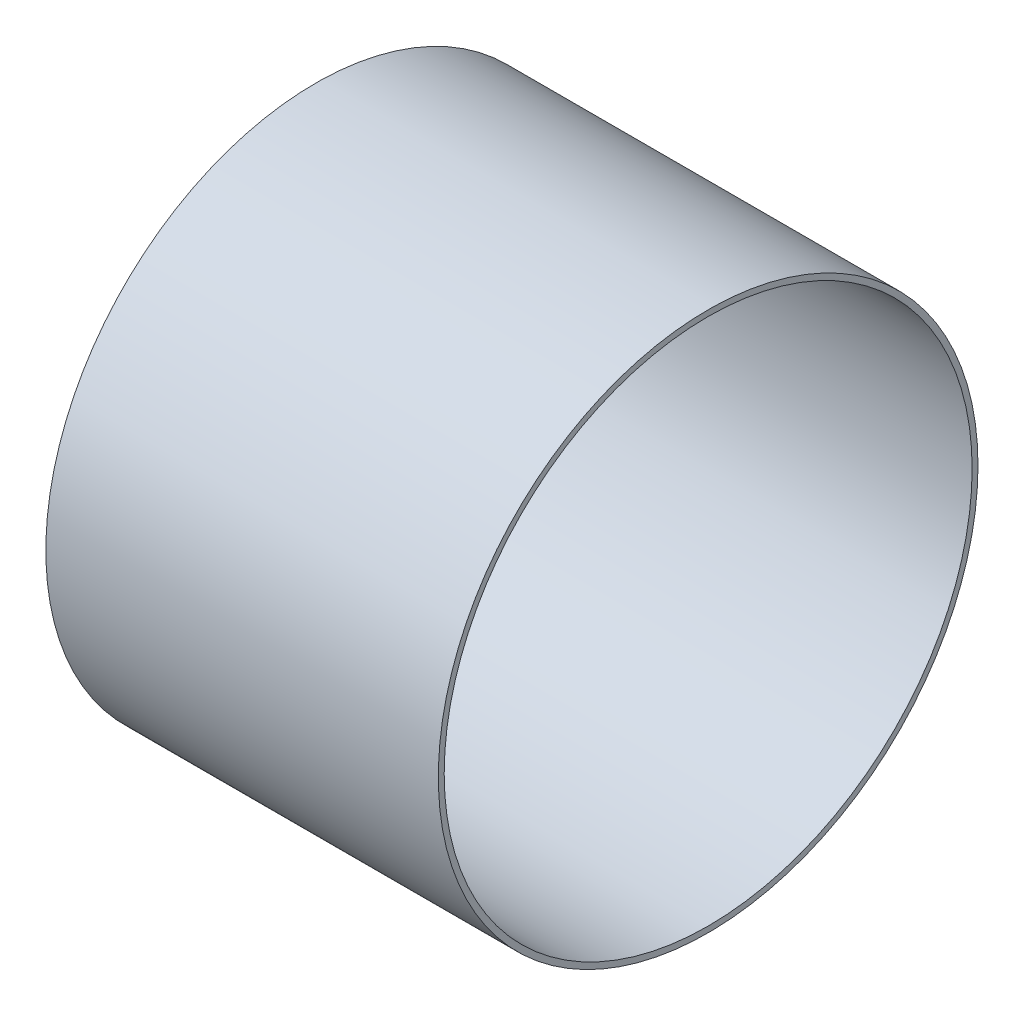
ISO-10303-21;
HEADER;
FILE_DESCRIPTION(('STEP AP214'),'2;1');
FILE_NAME('part.step','',(''),(''),'','','');
FILE_SCHEMA(('AUTOMOTIVE_DESIGN { 1 0 10303 214 1 1 1 1 }'));
ENDSEC;
DATA;
#1=APPLICATION_CONTEXT('core data for automotive mechanical design processes');
#2=APPLICATION_PROTOCOL_DEFINITION('international standard','automotive_design',2000,#1);
#3=PRODUCT_CONTEXT('',#1,'mechanical');
#4=PRODUCT('Part','Part','',(#3));
#5=PRODUCT_RELATED_PRODUCT_CATEGORY('part','',(#4));
#6=PRODUCT_DEFINITION_FORMATION('','',#4);
#7=PRODUCT_DEFINITION_CONTEXT('part definition',#1,'design');
#8=PRODUCT_DEFINITION('design','',#6,#7);
#9=PRODUCT_DEFINITION_SHAPE('','',#8);
#10=(LENGTH_UNIT() NAMED_UNIT(*) SI_UNIT(.MILLI.,.METRE.));
#11=(NAMED_UNIT(*) PLANE_ANGLE_UNIT() SI_UNIT($,.RADIAN.));
#12=(NAMED_UNIT(*) SI_UNIT($,.STERADIAN.) SOLID_ANGLE_UNIT());
#13=UNCERTAINTY_MEASURE_WITH_UNIT(LENGTH_MEASURE(1.E-05),#10,'distance_accuracy_value','');
#14=(GEOMETRIC_REPRESENTATION_CONTEXT(3) GLOBAL_UNCERTAINTY_ASSIGNED_CONTEXT((#13)) GLOBAL_UNIT_ASSIGNED_CONTEXT((#10,
#11,#12)) REPRESENTATION_CONTEXT('',''));
#15=CARTESIAN_POINT('',(0.,0.,0.));
#16=DIRECTION('',(0.,0.,1.));
#17=DIRECTION('',(1.,0.,0.));
#18=AXIS2_PLACEMENT_3D('',#15,#16,#17);
#19=CARTESIAN_POINT('',(101.6,0.,0.));
#20=DIRECTION('',(1.,0.,0.));
#21=DIRECTION('',(0.,0.,-1.));
#22=AXIS2_PLACEMENT_3D('',#19,#20,#21);
#23=PLANE('',#22);
#24=CARTESIAN_POINT('',(101.6,0.,0.));
#25=DIRECTION('',(1.,0.,0.));
#26=DIRECTION('',(0.,0.,-1.));
#27=AXIS2_PLACEMENT_3D('',#24,#25,#26);
#28=CIRCLE('',#27,69.85);
#29=CARTESIAN_POINT('',(101.6,0.,-69.85));
#30=VERTEX_POINT('',#29);
#31=EDGE_CURVE('E10',#30,#30,#28,.T.);
#32=ORIENTED_EDGE('',*,*,#31,.T.);
#33=EDGE_LOOP('',(#32));
#34=FACE_BOUND('',#33,.T.);
#35=CARTESIAN_POINT('',(101.6,0.,0.));
#36=DIRECTION('',(1.,0.,0.));
#37=DIRECTION('',(0.,0.,-1.));
#38=AXIS2_PLACEMENT_3D('',#35,#36,#37);
#39=CIRCLE('',#38,68.33108);
#40=CARTESIAN_POINT('',(101.6,0.,-68.33108));
#41=VERTEX_POINT('',#40);
#42=EDGE_CURVE('E54',#41,#41,#39,.T.);
#43=ORIENTED_EDGE('',*,*,#42,.F.);
#44=EDGE_LOOP('',(#43));
#45=FACE_BOUND('',#44,.T.);
#46=ADVANCED_FACE('F41',(#34,#45),#23,.T.);
#47=CARTESIAN_POINT('',(0.,0.,0.));
#48=DIRECTION('',(1.,0.,0.));
#49=DIRECTION('',(0.,0.,-1.));
#50=AXIS2_PLACEMENT_3D('',#47,#48,#49);
#51=PLANE('',#50);
#52=CARTESIAN_POINT('',(0.,0.,0.));
#53=DIRECTION('',(1.,0.,0.));
#54=DIRECTION('',(0.,0.,-1.));
#55=AXIS2_PLACEMENT_3D('',#52,#53,#54);
#56=CIRCLE('',#55,69.85);
#57=CARTESIAN_POINT('',(0.,0.,-69.85));
#58=VERTEX_POINT('',#57);
#59=EDGE_CURVE('E45',#58,#58,#56,.T.);
#60=ORIENTED_EDGE('',*,*,#59,.F.);
#61=EDGE_LOOP('',(#60));
#62=FACE_BOUND('',#61,.T.);
#63=CARTESIAN_POINT('',(0.,0.,0.));
#64=DIRECTION('',(1.,0.,0.));
#65=DIRECTION('',(0.,0.,-1.));
#66=AXIS2_PLACEMENT_3D('',#63,#64,#65);
#67=CIRCLE('',#66,68.33108);
#68=CARTESIAN_POINT('',(0.,0.,-68.33108));
#69=VERTEX_POINT('',#68);
#70=EDGE_CURVE('E56',#69,#69,#67,.T.);
#71=ORIENTED_EDGE('',*,*,#70,.T.);
#72=EDGE_LOOP('',(#71));
#73=FACE_BOUND('',#72,.T.);
#74=ADVANCED_FACE('F68',(#62,#73),#51,.F.);
#75=CARTESIAN_POINT('',(101.6,0.,0.));
#76=DIRECTION('',(-1.,0.,0.));
#77=DIRECTION('',(0.,0.,1.));
#78=AXIS2_PLACEMENT_3D('',#75,#76,#77);
#79=CYLINDRICAL_SURFACE('',#78,69.85);
#80=ORIENTED_EDGE('',*,*,#31,.F.);
#81=EDGE_LOOP('',(#80));
#82=FACE_BOUND('',#81,.T.);
#83=ORIENTED_EDGE('',*,*,#59,.T.);
#84=EDGE_LOOP('',(#83));
#85=FACE_BOUND('',#84,.T.);
#86=ADVANCED_FACE('F43',(#82,#85),#79,.T.);
#87=CARTESIAN_POINT('',(101.6,0.,0.));
#88=DIRECTION('',(-1.,0.,0.));
#89=DIRECTION('',(0.,0.,1.));
#90=AXIS2_PLACEMENT_3D('',#87,#88,#89);
#91=CYLINDRICAL_SURFACE('',#90,68.33108);
#92=ORIENTED_EDGE('',*,*,#42,.T.);
#93=EDGE_LOOP('',(#92));
#94=FACE_BOUND('',#93,.T.);
#95=ORIENTED_EDGE('',*,*,#70,.F.);
#96=EDGE_LOOP('',(#95));
#97=FACE_BOUND('',#96,.T.);
#98=ADVANCED_FACE('F64',(#94,#97),#91,.F.);
#99=CLOSED_SHELL('',(#46,#74,#86,#98));
#100=MANIFOLD_SOLID_BREP('B2',#99);
#101=ADVANCED_BREP_SHAPE_REPRESENTATION('',(#18,#100),#14);
#102=SHAPE_DEFINITION_REPRESENTATION(#9,#101);
ENDSEC;
END-ISO-10303-21;
